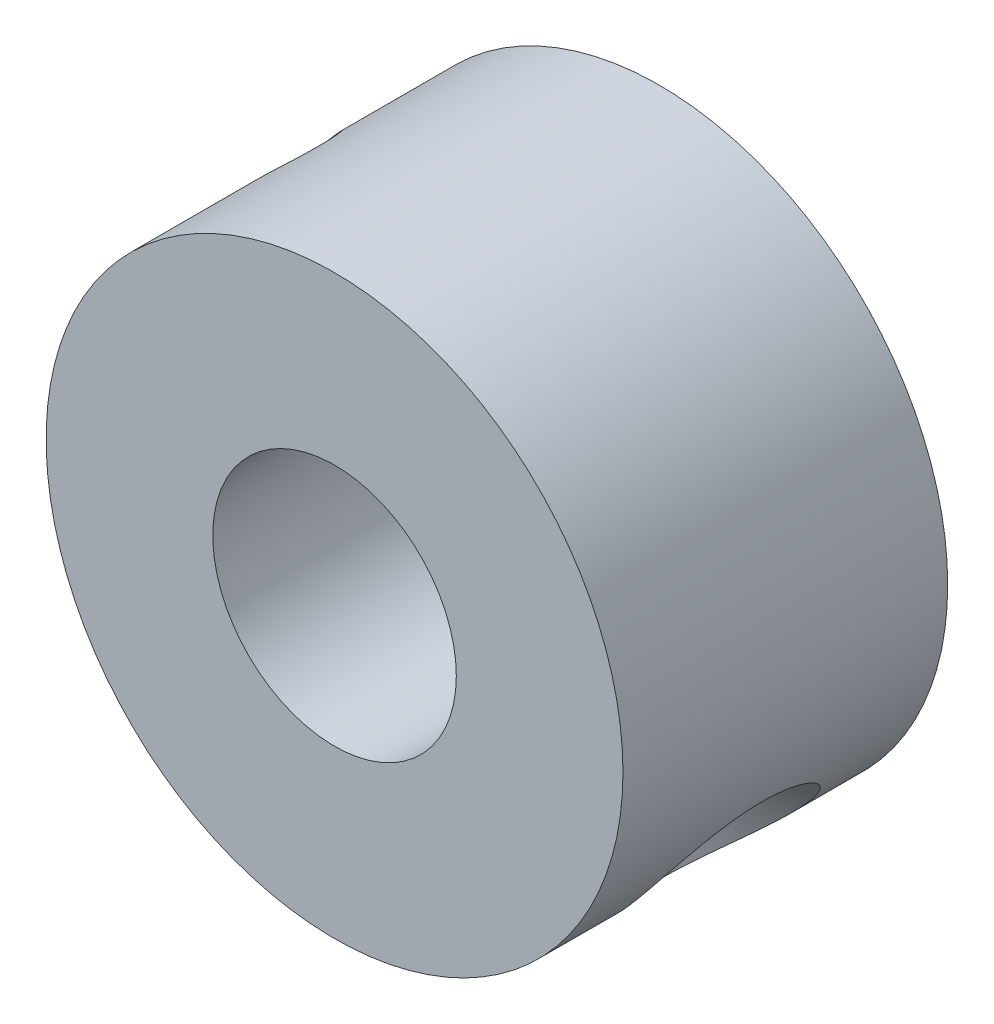
ISO-10303-21;
HEADER;
FILE_DESCRIPTION(('STEP AP214'),'2;1');
FILE_NAME('part.step','',(''),(''),'','','');
FILE_SCHEMA(('AUTOMOTIVE_DESIGN { 1 0 10303 214 1 1 1 1 }'));
ENDSEC;
DATA;
#1=APPLICATION_CONTEXT('core data for automotive mechanical design processes');
#2=APPLICATION_PROTOCOL_DEFINITION('international standard','automotive_design',2000,#1);
#3=PRODUCT_CONTEXT('',#1,'mechanical');
#4=PRODUCT('Part','Part','',(#3));
#5=PRODUCT_RELATED_PRODUCT_CATEGORY('part','',(#4));
#6=PRODUCT_DEFINITION_FORMATION('','',#4);
#7=PRODUCT_DEFINITION_CONTEXT('part definition',#1,'design');
#8=PRODUCT_DEFINITION('design','',#6,#7);
#9=PRODUCT_DEFINITION_SHAPE('','',#8);
#10=(LENGTH_UNIT() NAMED_UNIT(*) SI_UNIT(.MILLI.,.METRE.));
#11=(NAMED_UNIT(*) PLANE_ANGLE_UNIT() SI_UNIT($,.RADIAN.));
#12=(NAMED_UNIT(*) SI_UNIT($,.STERADIAN.) SOLID_ANGLE_UNIT());
#13=UNCERTAINTY_MEASURE_WITH_UNIT(LENGTH_MEASURE(1.E-05),#10,'distance_accuracy_value','');
#14=(GEOMETRIC_REPRESENTATION_CONTEXT(3) GLOBAL_UNCERTAINTY_ASSIGNED_CONTEXT((#13)) GLOBAL_UNIT_ASSIGNED_CONTEXT((#10,
#11,#12)) REPRESENTATION_CONTEXT('',''));
#15=CARTESIAN_POINT('',(0.,0.,0.));
#16=DIRECTION('',(0.,0.,1.));
#17=DIRECTION('',(1.,0.,0.));
#18=AXIS2_PLACEMENT_3D('',#15,#16,#17);
#19=CARTESIAN_POINT('',(0.,0.,8.));
#20=DIRECTION('',(0.,0.,1.));
#21=DIRECTION('',(1.,0.,0.));
#22=AXIS2_PLACEMENT_3D('',#19,#20,#21);
#23=PLANE('',#22);
#24=CARTESIAN_POINT('',(0.,0.,8.));
#25=DIRECTION('',(0.,0.,1.));
#26=DIRECTION('',(1.,0.,0.));
#27=AXIS2_PLACEMENT_3D('',#24,#25,#26);
#28=CIRCLE('',#27,7.10544357844535);
#29=CARTESIAN_POINT('',(7.10544357844535,0.,8.));
#30=VERTEX_POINT('',#29);
#31=EDGE_CURVE('E51',#30,#30,#28,.T.);
#32=ORIENTED_EDGE('',*,*,#31,.T.);
#33=EDGE_LOOP('',(#32));
#34=FACE_BOUND('',#33,.T.);
#35=CARTESIAN_POINT('',(0.,0.,8.));
#36=DIRECTION('',(0.,0.,1.));
#37=DIRECTION('',(1.,0.,0.));
#38=AXIS2_PLACEMENT_3D('',#35,#36,#37);
#39=CIRCLE('',#38,3.);
#40=CARTESIAN_POINT('',(3.,0.,8.));
#41=VERTEX_POINT('',#40);
#42=EDGE_CURVE('E95',#41,#41,#39,.T.);
#43=ORIENTED_EDGE('',*,*,#42,.F.);
#44=EDGE_LOOP('',(#43));
#45=FACE_BOUND('',#44,.T.);
#46=ADVANCED_FACE('F37',(#34,#45),#23,.T.);
#47=CARTESIAN_POINT('',(0.,0.,0.));
#48=DIRECTION('',(0.,0.,1.));
#49=DIRECTION('',(1.,0.,0.));
#50=AXIS2_PLACEMENT_3D('',#47,#48,#49);
#51=PLANE('',#50);
#52=CARTESIAN_POINT('',(0.,0.,0.));
#53=DIRECTION('',(0.,0.,1.));
#54=DIRECTION('',(1.,0.,0.));
#55=AXIS2_PLACEMENT_3D('',#52,#53,#54);
#56=CIRCLE('',#55,7.10544357844535);
#57=CARTESIAN_POINT('',(7.10544357844535,0.,0.));
#58=VERTEX_POINT('',#57);
#59=EDGE_CURVE('E56',#58,#58,#56,.T.);
#60=ORIENTED_EDGE('',*,*,#59,.F.);
#61=EDGE_LOOP('',(#60));
#62=FACE_BOUND('',#61,.T.);
#63=CARTESIAN_POINT('',(0.,0.,0.));
#64=DIRECTION('',(0.,0.,1.));
#65=DIRECTION('',(1.,0.,0.));
#66=AXIS2_PLACEMENT_3D('',#63,#64,#65);
#67=CIRCLE('',#66,3.);
#68=CARTESIAN_POINT('',(3.,0.,0.));
#69=VERTEX_POINT('',#68);
#70=EDGE_CURVE('E98',#69,#69,#67,.T.);
#71=ORIENTED_EDGE('',*,*,#70,.T.);
#72=EDGE_LOOP('',(#71));
#73=FACE_BOUND('',#72,.T.);
#74=ADVANCED_FACE('F111',(#62,#73),#51,.F.);
#75=CARTESIAN_POINT('',(0.,0.,8.));
#76=DIRECTION('',(0.,0.,-1.));
#77=DIRECTION('',(-1.,0.,0.));
#78=AXIS2_PLACEMENT_3D('',#75,#76,#77);
#79=CYLINDRICAL_SURFACE('',#78,7.10544357844535);
#80=CARTESIAN_POINT('',(-4.50937505106455,5.49116245391692,3.89373166564078));
#81=CARTESIAN_POINT('',(-4.50937772419131,5.49116122751686,3.96061846220511));
#82=CARTESIAN_POINT('',(-4.51378007882492,5.4875541277036,4.02754145852413));
#83=CARTESIAN_POINT('',(-4.5312039782094,5.47317473629324,4.15950876835359));
#84=CARTESIAN_POINT('',(-4.5442334071319,5.4623958904862,4.22455130653791));
#85=CARTESIAN_POINT('',(-4.57832524839055,5.43385288456868,4.35082878343272));
#86=CARTESIAN_POINT('',(-4.59938086950191,5.41609462957224,4.41206689039157));
#87=CARTESIAN_POINT('',(-4.64863791481128,5.37387582231153,4.52910267532087));
#88=CARTESIAN_POINT('',(-4.67683855996303,5.3494160007182,4.58490094549732));
#89=CARTESIAN_POINT('',(-4.7395531028768,5.29393318509752,4.69004412015648));
#90=CARTESIAN_POINT('',(-4.77412186838029,5.26285275284441,4.73932599698425));
#91=CARTESIAN_POINT('',(-4.84808394915338,5.19479846494605,4.82948983755151));
#92=CARTESIAN_POINT('',(-4.88747755314743,5.15782425656981,4.87037129820707));
#93=CARTESIAN_POINT('',(-4.96991416293464,5.07844178146862,4.94281089762019));
#94=CARTESIAN_POINT('',(-5.01297807529974,5.03600156812902,4.97431029848024));
#95=CARTESIAN_POINT('',(-5.1010279837703,4.94679339243217,5.02671399148741));
#96=CARTESIAN_POINT('',(-5.14601385136526,4.9000257191852,5.04761899082508));
#97=CARTESIAN_POINT('',(-5.23596692435485,4.80377711207891,5.07804747313021));
#98=CARTESIAN_POINT('',(-5.28093026989147,4.75432607653352,5.08767689348512));
#99=CARTESIAN_POINT('',(-5.36985718627042,4.65365140801609,5.09561036168938));
#100=CARTESIAN_POINT('',(-5.41382082659283,4.60242789885983,5.09391519903258));
#101=CARTESIAN_POINT('',(-5.49905451186641,4.50023468126244,5.07933009877426));
#102=CARTESIAN_POINT('',(-5.54034740179139,4.44926768887965,5.06655417625371));
#103=CARTESIAN_POINT('',(-5.61969591763066,4.3486154028192,5.03034983086333));
#104=CARTESIAN_POINT('',(-5.65775144284827,4.29893014904287,5.00692107678601));
#105=CARTESIAN_POINT('',(-5.7299798984195,4.20218088433,4.94996328965453));
#106=CARTESIAN_POINT('',(-5.76413378958573,4.1551302546206,4.91638741854323));
#107=CARTESIAN_POINT('',(-5.82773930516775,4.06544101160915,4.84012282775435));
#108=CARTESIAN_POINT('',(-5.85719053870827,4.02280276515891,4.79743335126101));
#109=CARTESIAN_POINT('',(-5.91128615262524,3.94289058979369,4.70352138169985));
#110=CARTESIAN_POINT('',(-5.93586609150651,3.90569009180749,4.6521992275417));
#111=CARTESIAN_POINT('',(-5.97943886776011,3.83865116596093,4.54281415892114));
#112=CARTESIAN_POINT('',(-5.99843165088219,3.80881280958607,4.48475117901418));
#113=CARTESIAN_POINT('',(-6.03063547400632,3.75761685723096,4.36341771432741));
#114=CARTESIAN_POINT('',(-6.04383970581538,3.73626925034906,4.30014120096911));
#115=CARTESIAN_POINT('',(-6.06429360405945,3.70297947147124,4.17024093993206));
#116=CARTESIAN_POINT('',(-6.0715438097519,3.6910364477042,4.10361749596565));
#117=CARTESIAN_POINT('',(-6.07996524654438,3.67714795742774,3.96978937397779));
#118=CARTESIAN_POINT('',(-6.0812099151312,3.67508171760633,3.90260183552776));
#119=CARTESIAN_POINT('',(-6.07780717865153,3.68070628307099,3.768789048656));
#120=CARTESIAN_POINT('',(-6.07316000753277,3.68839670094869,3.702163778014));
#121=CARTESIAN_POINT('',(-6.05807002020607,3.71312826682396,3.57181107068301));
#122=CARTESIAN_POINT('',(-6.04766516540027,3.7301081594782,3.50806758061586));
#123=CARTESIAN_POINT('',(-6.02118988288766,3.77269475772912,3.38477789977145));
#124=CARTESIAN_POINT('',(-6.00511910810953,3.79830199179755,3.32523196638771));
#125=CARTESIAN_POINT('',(-5.96730084985107,3.85744579390858,3.21140802057774));
#126=CARTESIAN_POINT('',(-5.94550110252161,3.89105508235055,3.15718517200185));
#127=CARTESIAN_POINT('',(-5.89655432365721,3.96483678749525,3.05611734989693));
#128=CARTESIAN_POINT('',(-5.86940690551986,4.00500967866864,3.00927291022056));
#129=CARTESIAN_POINT('',(-5.80981956548112,4.09097593278745,2.92378151314818));
#130=CARTESIAN_POINT('',(-5.77732614583553,4.13682481119791,2.88522758529244));
#131=CARTESIAN_POINT('',(-5.70780892827174,4.23222448469645,2.81806373625245));
#132=CARTESIAN_POINT('',(-5.67078527996335,4.28177515751253,2.78945348680018));
#133=CARTESIAN_POINT('',(-5.59314167994384,4.38270770884036,2.74313334785215));
#134=CARTESIAN_POINT('',(-5.5525386262432,4.4340803638542,2.72537508112663));
#135=CARTESIAN_POINT('',(-5.46857592243017,4.53722655831387,2.70110735479689));
#136=CARTESIAN_POINT('',(-5.42521650580045,4.58900006347957,2.69459694373583));
#137=CARTESIAN_POINT('',(-5.33748701861732,4.69073739565696,2.69303769773693));
#138=CARTESIAN_POINT('',(-5.29313620569819,4.74071571669769,2.69784742313683));
#139=CARTESIAN_POINT('',(-5.20422927316876,4.83814808801021,2.71848560270538));
#140=CARTESIAN_POINT('',(-5.15967315478557,4.88560215334817,2.73431399110051));
#141=CARTESIAN_POINT('',(-5.07182312804632,4.9767402457625,2.77648535654085));
#142=CARTESIAN_POINT('',(-5.0285278025918,5.02042862294948,2.80281599795212));
#143=CARTESIAN_POINT('',(-4.94458171106553,5.10312808487147,2.86522857678447));
#144=CARTESIAN_POINT('',(-4.90393107588863,5.1421389381801,2.90131099639984));
#145=CARTESIAN_POINT('',(-4.82622823788054,5.21514420002325,2.98270283865438));
#146=CARTESIAN_POINT('',(-4.78922393078684,5.24907427701251,3.02811570031565));
#147=CARTESIAN_POINT('',(-4.72073041866113,5.31075915254984,3.12666245223614));
#148=CARTESIAN_POINT('',(-4.68924250751312,5.33851250274331,3.17979814857198));
#149=CARTESIAN_POINT('',(-4.63282108790368,5.38755127879486,3.29274235274264));
#150=CARTESIAN_POINT('',(-4.60793700430337,5.40878810808347,3.35259665618387));
#151=CARTESIAN_POINT('',(-4.56609904828476,5.44415510167663,3.47694789257279));
#152=CARTESIAN_POINT('',(-4.54913729794625,5.45829232684124,3.5414401395984));
#153=CARTESIAN_POINT('',(-4.5275271008195,5.47621744929924,3.65410335710747));
#154=CARTESIAN_POINT('',(-4.52073552800368,5.48181662672035,3.70159428326632));
#155=CARTESIAN_POINT('',(-4.51165858214895,5.48928953583769,3.79729443053107));
#156=CARTESIAN_POINT('',(-4.50937312363436,5.49116333819991,3.84550363799454));
#157=CARTESIAN_POINT('',(-4.50937505106455,5.49116245391692,3.89373166564078));
#158=B_SPLINE_CURVE_WITH_KNOTS('',3,(#80,#81,#82,#83,#84,#85,#86,#87,#88,#89,#90,#91,#92,#93,
#94,#95,#96,#97,#98,#99,#100,#101,#102,#103,#104,#105,#106,#107,#108,#109,#110,#111,#112,#113,
#114,#115,#116,#117,#118,#119,#120,#121,#122,#123,#124,#125,#126,#127,#128,#129,#130,#131,#132,
#133,#134,#135,#136,#137,#138,#139,#140,#141,#142,#143,#144,#145,#146,#147,#148,#149,#150,#151,
#152,#153,#154,#155,#156,#157),.UNSPECIFIED.,.T.,.F.,(4,2,2,2,2,2,2,2,2,2,2,2,2,2,2,2,2,2,2,2,2,
2,2,2,2,2,2,2,2,2,2,2,2,2,2,2,2,2,4),(0.,0.200484015676709,0.401151504458043,0.60164957742745,
0.802125798810978,1.00441779864295,1.20672190980478,1.41026716929097,1.61379884006686,
1.81540252480201,2.01699215487309,2.21653181783769,2.41607768511976,2.61655908100714,
2.81705713183354,3.0200525109764,3.22304986110195,3.42628532975333,3.62950238929341,
3.83022804145482,4.03094572363685,4.23035554078252,4.42977757508937,4.63108615609952,
4.83240929577733,5.03588557020808,5.23935512669217,5.44191088695258,5.64444951216885,
5.84447097371198,6.04449124128061,6.2442772595987,6.44407315850545,6.64621673947725,
6.84840767042051,7.05207170458748,7.25553278302251,7.40009243546716,7.54464934575941),.UNSPECIFIED.);
#159=CARTESIAN_POINT('',(-4.50937505106455,5.49116245391692,3.89373166564078));
#160=VERTEX_POINT('',#159);
#161=EDGE_CURVE('E64',#160,#160,#158,.T.);
#162=ORIENTED_EDGE('',*,*,#161,.T.);
#163=EDGE_LOOP('',(#162));
#164=FACE_BOUND('',#163,.T.);
#165=CARTESIAN_POINT('',(4.47956733416629,-5.51550598198344,2.20813238535684));
#166=CARTESIAN_POINT('',(4.42104322603923,-5.56303834552205,2.27895514252438));
#167=CARTESIAN_POINT('',(4.36583162059138,-5.60633469621509,2.35539091729049));
#168=CARTESIAN_POINT('',(4.26338496262022,-5.68463226709767,2.51737382735488));
#169=CARTESIAN_POINT('',(4.21615889496595,-5.71962416121106,2.60293105148788));
#170=CARTESIAN_POINT('',(4.12307851454868,-5.78717943437482,2.79739367849769));
#171=CARTESIAN_POINT('',(4.079023995617,-5.81815334112509,2.90772036918832));
#172=CARTESIAN_POINT('',(4.00509252047673,-5.8692918006661,3.13539843462335));
#173=CARTESIAN_POINT('',(3.97522047354902,-5.88945261080227,3.25275222600132));
#174=CARTESIAN_POINT('',(3.92903528089336,-5.92037639627693,3.50049479700913));
#175=CARTESIAN_POINT('',(3.91389175955953,-5.93033168132014,3.63120488650345));
#176=CARTESIAN_POINT('',(3.90180199678988,-5.93829270930325,3.89382622916382));
#177=CARTESIAN_POINT('',(3.90485795826394,-5.93629700566611,4.02573762580947));
#178=CARTESIAN_POINT('',(3.92926804931417,-5.92016889198697,4.28962592898758));
#179=CARTESIAN_POINT('',(3.95096473249305,-5.90580926389434,4.42155754437891));
#180=CARTESIAN_POINT('',(4.01220266106053,-5.86437675231105,4.67917655459371));
#181=CARTESIAN_POINT('',(4.0517476232337,-5.837301220771,4.80486264277314));
#182=CARTESIAN_POINT('',(4.14678213423413,-5.77017153891629,5.04537901004675));
#183=CARTESIAN_POINT('',(4.2021661773567,-5.73020305159782,5.16027465096705));
#184=CARTESIAN_POINT('',(4.3268892132319,-5.63661391455267,5.37619701811627));
#185=CARTESIAN_POINT('',(4.39622730777277,-5.58299414348997,5.47722463631562));
#186=CARTESIAN_POINT('',(4.54167929548394,-5.46522622076208,5.65554626091196));
#187=CARTESIAN_POINT('',(4.61715391474586,-5.4018837929587,5.73388739871739));
#188=CARTESIAN_POINT('',(4.77494202874845,-5.26291099116189,5.87012899498412));
#189=CARTESIAN_POINT('',(4.85724554000032,-5.18729840605122,5.92805866542233));
#190=CARTESIAN_POINT('',(5.01316989896263,-5.03642250844033,6.01314261566742));
#191=CARTESIAN_POINT('',(5.08642072464596,-4.96255219274713,6.04344157294245));
#192=CARTESIAN_POINT('',(5.23207286662115,-4.80873246679424,6.08386554651034));
#193=CARTESIAN_POINT('',(5.30447495766388,-4.72878919614856,6.09401066331927));
#194=CARTESIAN_POINT('',(5.43662520982107,-4.5759543706009,6.09347596002817));
#195=CARTESIAN_POINT('',(5.49682349969637,-4.50343124769697,6.08524184609797));
#196=CARTESIAN_POINT('',(5.61267864256731,-4.35818688549083,6.05330386797442));
#197=CARTESIAN_POINT('',(5.66833571585565,-4.28546565597575,6.02960075467895));
#198=CARTESIAN_POINT('',(5.7735255863862,-4.14264943780636,5.96822120591871));
#199=CARTESIAN_POINT('',(5.82310698108995,-4.07253722994575,5.93066681960269));
#200=CARTESIAN_POINT('',(5.9161752833141,-3.93611844440016,5.84319098127286));
#201=CARTESIAN_POINT('',(5.95966039006296,-3.86981299458742,5.7932658870994));
#202=CARTESIAN_POINT('',(6.04442029043979,-3.73619895684954,5.67730925892715));
#203=CARTESIAN_POINT('',(6.08504848276416,-3.66944269200235,5.61017159480441));
#204=CARTESIAN_POINT('',(6.15901281418068,-3.54389750193642,5.4652870974004));
#205=CARTESIAN_POINT('',(6.19234513566954,-3.48511275394771,5.38753474431043));
#206=CARTESIAN_POINT('',(6.25621000121357,-3.36929191577346,5.21216566399982));
#207=CARTESIAN_POINT('',(6.28572933051941,-3.31360475528642,5.11328734618888));
#208=CARTESIAN_POINT('',(6.33644699894373,-3.21555893525055,4.9071453024547));
#209=CARTESIAN_POINT('',(6.35764156082011,-3.17320632778642,4.79987779646742));
#210=CARTESIAN_POINT('',(6.39399128294677,-3.0993683414689,4.56824822818956));
#211=CARTESIAN_POINT('',(6.40831060871126,-3.06943075255262,4.44325821267792));
#212=CARTESIAN_POINT('',(6.42793002981459,-3.02812942109677,4.18955651865789));
#213=CARTESIAN_POINT('',(6.43322844916357,-3.01676913003995,4.06084415309237));
#214=CARTESIAN_POINT('',(6.43501336243638,-3.01296279466041,3.79837746392874));
#215=CARTESIAN_POINT('',(6.4311725125297,-3.02121935696126,3.66460994950669));
#216=CARTESIAN_POINT('',(6.41385165090753,-3.05781576828704,3.40047009543418));
#217=CARTESIAN_POINT('',(6.40037017629166,-3.08615866527321,3.2700982741696));
#218=CARTESIAN_POINT('',(6.36326108833155,-3.16196350902075,3.01627318446301));
#219=CARTESIAN_POINT('',(6.33961516061142,-3.20945995716742,2.89283286134424));
#220=CARTESIAN_POINT('',(6.28139056270972,-3.32196625109307,2.65691032743473));
#221=CARTESIAN_POINT('',(6.24680987756188,-3.38697932436334,2.54443014128822));
#222=CARTESIAN_POINT('',(6.16708570006885,-3.52999387498244,2.33794603115939));
#223=CARTESIAN_POINT('',(6.1223167859276,-3.60751159580557,2.24346502570809));
#224=CARTESIAN_POINT('',(6.02094232830591,-3.77426135948135,2.072921279202));
#225=CARTESIAN_POINT('',(5.9643479596529,-3.86348231358361,1.99684129493861));
#226=CARTESIAN_POINT('',(5.84633195188582,-4.03951173280826,1.87494494056192));
#227=CARTESIAN_POINT('',(5.78616694349285,-4.12546512477349,1.82668883236509));
#228=CARTESIAN_POINT('',(5.65742783797227,-4.30029611652377,1.7514282814905));
#229=CARTESIAN_POINT('',(5.58886605839491,-4.38916929627626,1.72439313058362));
#230=CARTESIAN_POINT('',(5.45596608628286,-4.55293679224951,1.69582741714693));
#231=CARTESIAN_POINT('',(5.39247180684748,-4.62797828844581,1.69115047646117));
#232=CARTESIAN_POINT('',(5.26287598022058,-4.77483391476284,1.69901103248083));
#233=CARTESIAN_POINT('',(5.19677495620743,-4.84664868636534,1.71154509181416));
#234=CARTESIAN_POINT('',(5.06809355840205,-4.98095609328794,1.7518540872512));
#235=CARTESIAN_POINT('',(5.00553043568722,-5.04374760452202,1.77870658408903));
#236=CARTESIAN_POINT('',(4.88197217729013,-5.16343642762474,1.84570442600015));
#237=CARTESIAN_POINT('',(4.82097669931692,-5.22033503455617,1.88584684222193));
#238=CARTESIAN_POINT('',(4.71181274663131,-5.31889651268156,1.97033858560431));
#239=CARTESIAN_POINT('',(4.66316562016607,-5.36153499023434,2.01295648066241));
#240=CARTESIAN_POINT('',(4.56891792676901,-5.4420730723141,2.10538193362198));
#241=CARTESIAN_POINT('',(4.52331706446356,-5.47997313660133,2.15518879297844));
#242=CARTESIAN_POINT('',(4.47956733416629,-5.51550598198344,2.20813238535684));
#243=B_SPLINE_CURVE_WITH_KNOTS('',3,(#165,#166,#167,#168,#169,#170,#171,#172,#173,#174,#175,
#176,#177,#178,#179,#180,#181,#182,#183,#184,#185,#186,#187,#188,#189,#190,#191,#192,#193,#194,
#195,#196,#197,#198,#199,#200,#201,#202,#203,#204,#205,#206,#207,#208,#209,#210,#211,#212,#213,
#214,#215,#216,#217,#218,#219,#220,#221,#222,#223,#224,#225,#226,#227,#228,#229,#230,#231,#232,
#233,#234,#235,#236,#237,#238,#239,#240,#241,#242),.UNSPECIFIED.,.T.,.F.,(4,2,2,2,2,2,2,2,2,2,2,
2,2,2,2,2,2,2,2,2,2,2,2,2,2,2,2,2,2,2,2,2,2,2,2,2,2,2,4),(0.,0.310109529438269,
0.620565687538088,0.987287207965463,1.35413557713312,1.74818552262926,2.1422831658631,
2.54378178528585,2.94536405271136,3.34433127479546,3.74327282387003,4.11872656880365,
4.49364077755461,4.8167943508044,5.13962546336748,5.42208315417118,5.70452713490219,
5.98453963268918,6.2646346693696,6.5725000621624,6.88052616408888,7.23085579488398,
7.58134419953196,7.96755899049857,8.35384552829901,8.75417481743546,9.15456486676061,
9.55567938540442,9.9568678612156,10.3451819592165,10.7331307540708,11.0774952002683,
11.4213604032862,11.7150410157153,12.0086629829333,12.285319893491,12.5619158745425,
12.7937609425734,13.0255834975806),.UNSPECIFIED.);
#244=CARTESIAN_POINT('',(4.47956733416629,-5.51550598198344,2.20813238535684));
#245=VERTEX_POINT('',#244);
#246=EDGE_CURVE('E11',#245,#245,#243,.T.);
#247=ORIENTED_EDGE('',*,*,#246,.T.);
#248=EDGE_LOOP('',(#247));
#249=FACE_BOUND('',#248,.T.);
#250=ORIENTED_EDGE('',*,*,#31,.F.);
#251=EDGE_LOOP('',(#250));
#252=FACE_BOUND('',#251,.T.);
#253=ORIENTED_EDGE('',*,*,#59,.T.);
#254=EDGE_LOOP('',(#253));
#255=FACE_BOUND('',#254,.T.);
#256=ADVANCED_FACE('F39',(#164,#249,#252,#255),#79,.T.);
#257=CARTESIAN_POINT('',(0.,0.,8.));
#258=DIRECTION('',(0.,0.,-1.));
#259=DIRECTION('',(-1.,0.,0.));
#260=AXIS2_PLACEMENT_3D('',#257,#258,#259);
#261=CYLINDRICAL_SURFACE('',#260,3.);
#262=CARTESIAN_POINT('',(-1.29332117580051,2.70690235070015,3.89373166564078));
#263=CARTESIAN_POINT('',(-1.2933306975009,2.70690127238722,3.95801536450072));
#264=CARTESIAN_POINT('',(-1.29845063133725,2.70447028696874,4.0223899864636));
#265=CARTESIAN_POINT('',(-1.3185881044364,2.69470633654069,4.14929256536702));
#266=CARTESIAN_POINT('',(-1.33363093472653,2.68736084497721,4.21181537588907));
#267=CARTESIAN_POINT('',(-1.37250802169924,2.66771263559964,4.33296343082281));
#268=CARTESIAN_POINT('',(-1.39630914527605,2.65542858462662,4.39160239405693));
#269=CARTESIAN_POINT('',(-1.45131090127575,2.62577015015196,4.50386269615655));
#270=CARTESIAN_POINT('',(-1.48250991791023,2.60839687800237,4.5574851271313));
#271=CARTESIAN_POINT('',(-1.5525787607001,2.56733887415712,4.66128790698565));
#272=CARTESIAN_POINT('',(-1.59176249379641,2.54337354750686,4.71114551939846));
#273=CARTESIAN_POINT('',(-1.67488972740266,2.48941725526088,4.80304906403));
#274=CARTESIAN_POINT('',(-1.71883488278192,2.45942419156223,4.84509226641469));
#275=CARTESIAN_POINT('',(-1.81149022026901,2.3920507547016,4.9217755038304));
#276=CARTESIAN_POINT('',(-1.86031996715815,2.35442572159686,4.95605824652316));
#277=CARTESIAN_POINT('',(-1.95910168543209,2.2728864839479,5.01383780667466));
#278=CARTESIAN_POINT('',(-2.0090531914662,2.2289748481393,5.03733901310995));
#279=CARTESIAN_POINT('',(-2.10558315674165,2.13792091246932,5.07173655750321));
#280=CARTESIAN_POINT('',(-2.15220783778918,2.09103794088519,5.08318805409419));
#281=CARTESIAN_POINT('',(-2.24284244165314,1.9935101425388,5.09494875703839));
#282=CARTESIAN_POINT('',(-2.28685333359552,1.94286672592454,5.09526211920168));
#283=CARTESIAN_POINT('',(-2.36847061730735,1.84236406347111,5.08504200377578));
#284=CARTESIAN_POINT('',(-2.4062978921169,1.79262055309237,5.07511680199262));
#285=CARTESIAN_POINT('',(-2.47753778913243,1.69279893947927,5.04573593985432));
#286=CARTESIAN_POINT('',(-2.51095008718424,1.64272081196009,5.02627958020054));
#287=CARTESIAN_POINT('',(-2.57340224987809,1.54308555171614,4.97814977591499));
#288=CARTESIAN_POINT('',(-2.60236862656201,1.49354764612256,4.94934183675146));
#289=CARTESIAN_POINT('',(-2.65525666298051,1.39736506754701,4.88345266148937));
#290=CARTESIAN_POINT('',(-2.67917658819798,1.35072139321771,4.8463685897822));
#291=CARTESIAN_POINT('',(-2.72357449573292,1.25893210197421,4.76214218407282));
#292=CARTESIAN_POINT('',(-2.74372339034916,1.21408589919357,4.71449933009048));
#293=CARTESIAN_POINT('',(-2.77892610267509,1.13119501814187,4.6119373225482));
#294=CARTESIAN_POINT('',(-2.79397825356123,1.09315256686438,4.55701579674828));
#295=CARTESIAN_POINT('',(-2.81981717923215,1.02470061968167,4.43948025219541));
#296=CARTESIAN_POINT('',(-2.83047146244563,0.994537080866745,4.37669276735049));
#297=CARTESIAN_POINT('',(-2.84734677178051,0.945148487727986,4.24640237136357));
#298=CARTESIAN_POINT('',(-2.85357067778313,0.925916329312863,4.17890255477827));
#299=CARTESIAN_POINT('',(-2.86166454417926,0.900579461412223,4.04551019917915));
#300=CARTESIAN_POINT('',(-2.86377726891748,0.893744542213615,3.97977139736868));
#301=CARTESIAN_POINT('',(-2.86449635967819,0.891439267588481,3.84808534098001));
#302=CARTESIAN_POINT('',(-2.86310378900143,0.895965465865042,3.78213815567408));
#303=CARTESIAN_POINT('',(-2.85692538190376,0.915461430070268,3.65585630466786));
#304=CARTESIAN_POINT('',(-2.85233732823288,0.929821694090775,3.59541590320108));
#305=CARTESIAN_POINT('',(-2.83978758020349,0.967469540780769,3.47775862276918));
#306=CARTESIAN_POINT('',(-2.83182513777469,0.990759102882568,3.4205424617764));
#307=CARTESIAN_POINT('',(-2.81183463690541,1.04617619785707,3.30837025096349));
#308=CARTESIAN_POINT('',(-2.79965479895343,1.07862383861807,3.25359995242411));
#309=CARTESIAN_POINT('',(-2.77092781222699,1.1504139292211,3.15004187317579));
#310=CARTESIAN_POINT('',(-2.75437888396998,1.18975918618782,3.10125654196343));
#311=CARTESIAN_POINT('',(-2.7151164590801,1.27694543331764,3.00730762048126));
#312=CARTESIAN_POINT('',(-2.69203790759569,1.32519929201552,2.96267772646617));
#313=CARTESIAN_POINT('',(-2.64001790506733,1.42601513262342,2.88262541967459));
#314=CARTESIAN_POINT('',(-2.61107621546327,1.47857728977822,2.84720338168245));
#315=CARTESIAN_POINT('',(-2.54724793991218,1.58600945408493,2.78670308976405));
#316=CARTESIAN_POINT('',(-2.51236278023115,1.6408789051773,2.76162235914132));
#317=CARTESIAN_POINT('',(-2.43702975594752,1.75080408930295,2.72280235419621));
#318=CARTESIAN_POINT('',(-2.39658492419984,1.80585970491822,2.70905692477675));
#319=CARTESIAN_POINT('',(-2.31389006571911,1.91051555088166,2.69402884466556));
#320=CARTESIAN_POINT('',(-2.27192997863215,1.96023735355608,2.6919915885632));
#321=CARTESIAN_POINT('',(-2.18522225758194,2.05645207231541,2.69844495321126));
#322=CARTESIAN_POINT('',(-2.14047504655541,2.10294547604552,2.70693398031216));
#323=CARTESIAN_POINT('',(-2.05112023003731,2.19013412540394,2.73365973865588));
#324=CARTESIAN_POINT('',(-2.00655055850348,2.23096360686211,2.75158903328613));
#325=CARTESIAN_POINT('',(-1.91772026315485,2.30776953355097,2.79636334837789));
#326=CARTESIAN_POINT('',(-1.87345969787917,2.34374508196703,2.823210013253));
#327=CARTESIAN_POINT('',(-1.78482936283512,2.41198064155861,2.8863935847344));
#328=CARTESIAN_POINT('',(-1.74054119871138,2.4440062093104,2.92309744257184));
#329=CARTESIAN_POINT('',(-1.65558291932977,2.50234001580749,3.00440477714815));
#330=CARTESIAN_POINT('',(-1.61491431207936,2.52864587809067,3.04901152351686));
#331=CARTESIAN_POINT('',(-1.53647579532583,2.57711050389834,3.14812080035582));
#332=CARTESIAN_POINT('',(-1.49904118767117,2.59891172507516,3.20306498968146));
#333=CARTESIAN_POINT('',(-1.43205245002944,2.63641921871087,3.31949694809805));
#334=CARTESIAN_POINT('',(-1.40249924661878,2.6521247746323,3.3809854853867));
#335=CARTESIAN_POINT('',(-1.35537161095265,2.67649177124234,3.50315398674963));
#336=CARTESIAN_POINT('',(-1.33695986311385,2.68565908535585,3.56341080649149));
#337=CARTESIAN_POINT('',(-1.30942639236804,2.6991937199634,3.68642291741899));
#338=CARTESIAN_POINT('',(-1.30027878473219,2.70357441735872,3.74917073522097));
#339=CARTESIAN_POINT('',(-1.29422771307401,2.70646839064786,3.83935820304354));
#340=CARTESIAN_POINT('',(-1.2933171476972,2.70690280687454,3.86653679823935));
#341=CARTESIAN_POINT('',(-1.29332117580051,2.70690235070015,3.89373166564078));
#342=B_SPLINE_CURVE_WITH_KNOTS('',3,(#262,#263,#264,#265,#266,#267,#268,#269,#270,#271,#272,
#273,#274,#275,#276,#277,#278,#279,#280,#281,#282,#283,#284,#285,#286,#287,#288,#289,#290,#291,
#292,#293,#294,#295,#296,#297,#298,#299,#300,#301,#302,#303,#304,#305,#306,#307,#308,#309,#310,
#311,#312,#313,#314,#315,#316,#317,#318,#319,#320,#321,#322,#323,#324,#325,#326,#327,#328,#329,
#330,#331,#332,#333,#334,#335,#336,#337,#338,#339,#340,#341),.UNSPECIFIED.,.T.,.F.,(4,2,2,2,2,2,
2,2,2,2,2,2,2,2,2,2,2,2,2,2,2,2,2,2,2,2,2,2,2,2,2,2,2,2,2,2,2,2,2,4),(0.,0.192766589260591,
0.386026401493344,0.57856249397603,0.771056572943164,0.973533709706542,1.17608144609005,
1.38661601454856,1.59706480181687,1.79732509732309,1.99751067183402,2.1864518689818,
2.37540693077434,2.56720980140937,2.75907848964017,2.96354426448811,3.16807684276274,
3.37838675228743,3.58855982876464,3.78589288511056,3.98316608941167,4.1692034884749,
4.35528215187386,4.54890692788023,4.74261068711912,4.9506224054459,5.15864258908051,
5.3666129238409,5.57447025568884,5.76876623849974,5.96303280903963,6.15133196662413,
6.33966586693553,6.53632230680357,6.73306029934925,6.94197751967769,7.15091929051914,
7.34109996487847,7.53074778127947,7.61229663312434),.UNSPECIFIED.);
#343=CARTESIAN_POINT('',(-1.29332117580051,2.70690235070015,3.89373166564078));
#344=VERTEX_POINT('',#343);
#345=EDGE_CURVE('E42',#344,#344,#342,.T.);
#346=ORIENTED_EDGE('',*,*,#345,.F.);
#347=EDGE_LOOP('',(#346));
#348=FACE_BOUND('',#347,.T.);
#349=CARTESIAN_POINT('',(2.86419198689431,-0.892414848716909,3.89373166564078));
#350=CARTESIAN_POINT('',(2.86419228303049,-0.892424426704197,3.82944796678085));
#351=CARTESIAN_POINT('',(2.8625194293366,-0.897839680448231,3.76507334481796));
#352=CARTESIAN_POINT('',(2.85573941216329,-0.919167688276208,3.63817076591454));
#353=CARTESIAN_POINT('',(2.85062347242567,-0.935107266377523,3.57564795539249));
#354=CARTESIAN_POINT('',(2.83674422053958,-0.976397051922026,3.45449990045876));
#355=CARTESIAN_POINT('',(2.82799463882257,-1.00171179489137,3.39586093722463));
#356=CARTESIAN_POINT('',(2.80651707028848,-1.06039339293028,3.28360063512502));
#357=CARTESIAN_POINT('',(2.79378995202024,-1.09375848973411,3.22997820415027));
#358=CARTESIAN_POINT('',(2.76318761088852,-1.16898414444662,3.12617542429592));
#359=CARTESIAN_POINT('',(2.74507963012967,-1.21119555112365,3.07631781188311));
#360=CARTESIAN_POINT('',(2.70358163004477,-1.30119185343055,2.98441426725157));
#361=CARTESIAN_POINT('',(2.68018977118184,-1.34897868728963,2.94237106486688));
#362=CARTESIAN_POINT('',(2.62677712760402,-1.45032601614091,2.86568782745117));
#363=CARTESIAN_POINT('',(2.59653132339469,-1.50403987492168,2.8314050847584));
#364=CARTESIAN_POINT('',(2.52997602766626,-1.61347875170698,2.77362552460691));
#365=CARTESIAN_POINT('',(2.49366901178545,-1.66920294135827,2.75012431817162));
#366=CARTESIAN_POINT('',(2.41737464319436,-1.77777560236627,2.71572677377835));
#367=CARTESIAN_POINT('',(2.3776505648729,-1.83063268806775,2.70427527718738));
#368=CARTESIAN_POINT('',(2.29410492695521,-1.93429767373213,2.69251457424318));
#369=CARTESIAN_POINT('',(2.25028490173892,-1.98510633092728,2.69220121207989));
#370=CARTESIAN_POINT('',(2.16250393147304,-2.08027285560852,2.70242132750578));
#371=CARTESIAN_POINT('',(2.11868915591665,-2.12483275896637,2.71234652928895));
#372=CARTESIAN_POINT('',(2.03009635956436,-2.20963130792558,2.74172739142724));
#373=CARTESIAN_POINT('',(1.98531826832074,-2.2498696361899,2.76118375108103));
#374=CARTESIAN_POINT('',(1.8956516575976,-2.3259443141744,2.80931355536657));
#375=CARTESIAN_POINT('',(1.85077164496785,-2.3617051801475,2.83812149453011));
#376=CARTESIAN_POINT('',(1.7631527274801,-2.42781991463175,2.9040106697922));
#377=CARTESIAN_POINT('',(1.72041456263294,-2.45817192350834,2.94109474149937));
#378=CARTESIAN_POINT('',(1.63592802973019,-2.51525496773809,3.02532114720875));
#379=CARTESIAN_POINT('',(1.59442887122697,-2.54161743540755,3.07296400119109));
#380=CARTESIAN_POINT('',(1.51743247352003,-2.58832593417152,3.17552600873337));
#381=CARTESIAN_POINT('',(1.48193719970413,-2.6086699967509,3.23044753453329));
#382=CARTESIAN_POINT('',(1.41789023388447,-2.64404379103747,3.34798307908616));
#383=CARTESIAN_POINT('',(1.38956299427037,-2.65890717963083,3.41077056393108));
#384=CARTESIAN_POINT('',(1.3430995293401,-2.68268018162989,3.54106095991799));
#385=CARTESIAN_POINT('',(1.32495668547869,-2.69159366242329,3.60856077650329));
#386=CARTESIAN_POINT('',(1.30103977814,-2.7032319222419,3.74195313210242));
#387=CARTESIAN_POINT('',(1.29457778832992,-2.70630151732358,3.80769193391288));
#388=CARTESIAN_POINT('',(1.29239922751171,-2.70734327323586,3.93937799030155));
#389=CARTESIAN_POINT('',(1.29667939796193,-2.70531697985988,4.00532517560749));
#390=CARTESIAN_POINT('',(1.31508984408362,-2.69641075685816,4.13160702661371));
#391=CARTESIAN_POINT('',(1.32864521692864,-2.6898138419536,4.19204742808049));
#392=CARTESIAN_POINT('',(1.36410825171361,-2.67200289869292,4.30970470851239));
#393=CARTESIAN_POINT('',(1.38601776558007,-2.6607878465548,4.36692086950517));
#394=CARTESIAN_POINT('',(1.43800157655275,-2.63306857641336,4.47909308031807));
#395=CARTESIAN_POINT('',(1.46837095113109,-2.61636830901396,4.53386337885745));
#396=CARTESIAN_POINT('',(1.5353081461752,-2.57765824837333,4.63742145810578));
#397=CARTESIAN_POINT('',(1.57187849005165,-2.55564629205431,4.68620678931814));
#398=CARTESIAN_POINT('',(1.65254471703706,-2.50430489042995,4.78015571080031));
#399=CARTESIAN_POINT('',(1.69699694524613,-2.4745550362269,4.8247856048154));
#400=CARTESIAN_POINT('',(1.78932567225106,-2.40863599079861,4.90483791160698));
#401=CARTESIAN_POINT('',(1.83720231032845,-2.37246653837935,4.94025994959912));
#402=CARTESIAN_POINT('',(1.9343884535094,-2.29391354823218,5.00076024151751));
#403=CARTESIAN_POINT('',(1.98369761249884,-2.25153150169236,5.02584097214025));
#404=CARTESIAN_POINT('',(2.08170381239706,-2.16123534765307,5.06466097708535));
#405=CARTESIAN_POINT('',(2.13040117134867,-2.11332425857119,5.07840640650481));
#406=CARTESIAN_POINT('',(2.22213824254069,-2.01649659990599,5.09343448661601));
#407=CARTESIAN_POINT('',(2.26533978867958,-1.96784957552887,5.09547174271836));
#408=CARTESIAN_POINT('',(2.34814813647523,-1.8682590211022,5.08901837807031));
#409=CARTESIAN_POINT('',(2.38775548130969,-1.81731583980943,5.0805293509694));
#410=CARTESIAN_POINT('',(2.46125174417238,-1.7163978376634,5.05380359262569));
#411=CARTESIAN_POINT('',(2.4952789463795,-1.66644133972036,5.03587429799544));
#412=CARTESIAN_POINT('',(2.55857456875972,-1.56752907590155,4.99109998290368));
#413=CARTESIAN_POINT('',(2.58784210974041,-1.51857349636967,4.96425331802857));
#414=CARTESIAN_POINT('',(2.64268430195494,-1.42108625702061,4.90106974654717));
#415=CARTESIAN_POINT('',(2.66803860987102,-1.37266893014921,4.86436588870973));
#416=CARTESIAN_POINT('',(2.71360684651716,-1.28023366618093,4.78305855413341));
#417=CARTESIAN_POINT('',(2.73381863919128,-1.23621756182073,4.73845180776471));
#418=CARTESIAN_POINT('',(2.77055289816445,-1.15164797459894,4.63934253092575));
#419=CARTESIAN_POINT('',(2.78676951538609,-1.11147753246862,4.58439834160011));
#420=CARTESIAN_POINT('',(2.81429894596599,-1.03980861660119,4.46796638318351));
#421=CARTESIAN_POINT('',(2.82561118283905,-1.00831116248883,4.40647784589486));
#422=CARTESIAN_POINT('',(2.84297926900155,-0.958180192516907,4.28430934453193));
#423=CARTESIAN_POINT('',(2.84941589063369,-0.938645556392838,4.22405252479007));
#424=CARTESIAN_POINT('',(2.8588687645097,-0.909457861712468,4.10104041386257));
#425=CARTESIAN_POINT('',(2.86189454958993,-0.899777269799933,4.0382925960606));
#426=CARTESIAN_POINT('',(2.86389229827085,-0.893374180715853,3.94810512823802));
#427=CARTESIAN_POINT('',(2.86419186161552,-0.892410796801744,3.92092653304222));
#428=CARTESIAN_POINT('',(2.86419198689431,-0.892414848716909,3.89373166564078));
#429=B_SPLINE_CURVE_WITH_KNOTS('',3,(#349,#350,#351,#352,#353,#354,#355,#356,#357,#358,#359,
#360,#361,#362,#363,#364,#365,#366,#367,#368,#369,#370,#371,#372,#373,#374,#375,#376,#377,#378,
#379,#380,#381,#382,#383,#384,#385,#386,#387,#388,#389,#390,#391,#392,#393,#394,#395,#396,#397,
#398,#399,#400,#401,#402,#403,#404,#405,#406,#407,#408,#409,#410,#411,#412,#413,#414,#415,#416,
#417,#418,#419,#420,#421,#422,#423,#424,#425,#426,#427,#428),.UNSPECIFIED.,.T.,.F.,(4,2,2,2,2,2,
2,2,2,2,2,2,2,2,2,2,2,2,2,2,2,2,2,2,2,2,2,2,2,2,2,2,2,2,2,2,2,2,2,4),(0.,0.192766589260591,
0.386026401493345,0.578562493976031,0.771056572943164,0.973533709706542,1.17608144609005,
1.38661601454856,1.59706480181687,1.79732509732309,1.99751067183402,2.1864518689818,
2.37540693077434,2.56720980140937,2.75907848964017,2.96354426448811,3.16807684276274,
3.37838675228743,3.58855982876464,3.78589288511056,3.98316608941167,4.1692034884749,
4.35528215187386,4.54890692788024,4.74261068711912,4.9506224054459,5.15864258908051,
5.3666129238409,5.57447025568884,5.76876623849974,5.96303280903963,6.15133196662413,
6.33966586693553,6.53632230680356,6.73306029934925,6.94197751967769,7.15091929051914,
7.34109996487847,7.53074778127947,7.61229663312434),.UNSPECIFIED.);
#430=CARTESIAN_POINT('',(2.86419198689431,-0.892414848716909,3.89373166564078));
#431=VERTEX_POINT('',#430);
#432=EDGE_CURVE('E82',#431,#431,#429,.T.);
#433=ORIENTED_EDGE('',*,*,#432,.F.);
#434=EDGE_LOOP('',(#433));
#435=FACE_BOUND('',#434,.T.);
#436=ORIENTED_EDGE('',*,*,#42,.T.);
#437=EDGE_LOOP('',(#436));
#438=FACE_BOUND('',#437,.T.);
#439=ORIENTED_EDGE('',*,*,#70,.F.);
#440=EDGE_LOOP('',(#439));
#441=FACE_BOUND('',#440,.T.);
#442=ADVANCED_FACE('F72',(#348,#435,#438,#441),#261,.F.);
#443=CARTESIAN_POINT('',(5.37197440380679,-4.65072246552243,3.89373166564078));
#444=DIRECTION('',(0.756036459159691,-0.654529504622425,0.));
#445=DIRECTION('',(0.654529504622425,0.756036459159691,0.));
#446=AXIS2_PLACEMENT_3D('',#443,#444,#445);
#447=CONICAL_SURFACE('',#446,2.2,0.785398163397453);
#448=CARTESIAN_POINT('',(4.6159379446471,-3.9961929609,3.89373166564078));
#449=DIRECTION('',(0.756036459159691,-0.654529504622425,0.));
#450=DIRECTION('',(0.654529504622425,0.756036459159691,0.));
#451=AXIS2_PLACEMENT_3D('',#448,#449,#450);
#452=CIRCLE('',#451,1.19999999999999);
#453=CARTESIAN_POINT('',(5.401373350194,-3.08894920990839,3.89373166564078));
#454=VERTEX_POINT('',#453);
#455=EDGE_CURVE('E87',#454,#454,#452,.T.);
#456=ORIENTED_EDGE('',*,*,#455,.F.);
#457=EDGE_LOOP('',(#456));
#458=FACE_BOUND('',#457,.T.);
#459=ORIENTED_EDGE('',*,*,#246,.F.);
#460=EDGE_LOOP('',(#459));
#461=FACE_BOUND('',#460,.T.);
#462=ADVANCED_FACE('F68',(#458,#461),#447,.F.);
#463=CARTESIAN_POINT('',(5.37197440380679,-4.65072246552243,3.89373166564078));
#464=DIRECTION('',(0.756036459159691,-0.654529504622425,0.));
#465=DIRECTION('',(0.654529504622425,0.756036459159691,0.));
#466=AXIS2_PLACEMENT_3D('',#463,#464,#465);
#467=CYLINDRICAL_SURFACE('',#466,1.19999999999999);
#468=ORIENTED_EDGE('',*,*,#432,.T.);
#469=EDGE_LOOP('',(#468));
#470=FACE_BOUND('',#469,.T.);
#471=ORIENTED_EDGE('',*,*,#455,.T.);
#472=EDGE_LOOP('',(#471));
#473=FACE_BOUND('',#472,.T.);
#474=ADVANCED_FACE('F71',(#470,#473),#467,.F.);
#475=ORIENTED_EDGE('',*,*,#345,.T.);
#476=EDGE_LOOP('',(#475));
#477=FACE_BOUND('',#476,.T.);
#478=ORIENTED_EDGE('',*,*,#161,.F.);
#479=EDGE_LOOP('',(#478));
#480=FACE_BOUND('',#479,.T.);
#481=ADVANCED_FACE('F76',(#477,#480),#467,.F.);
#482=CLOSED_SHELL('',(#46,#74,#256,#442,#462,#474,#481));
#483=MANIFOLD_SOLID_BREP('B2',#482);
#484=ADVANCED_BREP_SHAPE_REPRESENTATION('',(#18,#483),#14);
#485=SHAPE_DEFINITION_REPRESENTATION(#9,#484);
ENDSEC;
END-ISO-10303-21;
